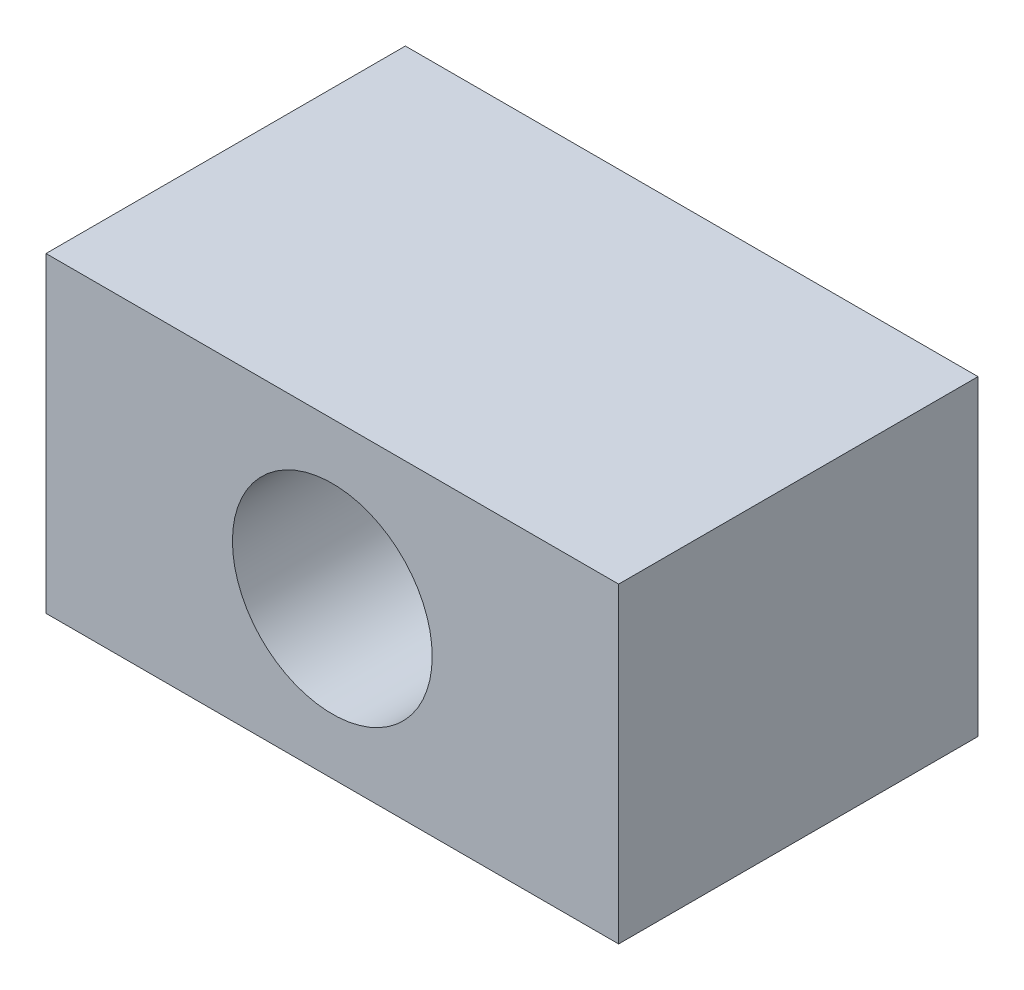
ISO-10303-21;
HEADER;
FILE_DESCRIPTION(('STEP AP214'),'2;1');
FILE_NAME('part.step','',(''),(''),'','','');
FILE_SCHEMA(('AUTOMOTIVE_DESIGN { 1 0 10303 214 1 1 1 1 }'));
ENDSEC;
DATA;
#1=APPLICATION_CONTEXT('core data for automotive mechanical design processes');
#2=APPLICATION_PROTOCOL_DEFINITION('international standard','automotive_design',2000,#1);
#3=PRODUCT_CONTEXT('',#1,'mechanical');
#4=PRODUCT('Part','Part','',(#3));
#5=PRODUCT_RELATED_PRODUCT_CATEGORY('part','',(#4));
#6=PRODUCT_DEFINITION_FORMATION('','',#4);
#7=PRODUCT_DEFINITION_CONTEXT('part definition',#1,'design');
#8=PRODUCT_DEFINITION('design','',#6,#7);
#9=PRODUCT_DEFINITION_SHAPE('','',#8);
#10=(LENGTH_UNIT() NAMED_UNIT(*) SI_UNIT(.MILLI.,.METRE.));
#11=(NAMED_UNIT(*) PLANE_ANGLE_UNIT() SI_UNIT($,.RADIAN.));
#12=(NAMED_UNIT(*) SI_UNIT($,.STERADIAN.) SOLID_ANGLE_UNIT());
#13=UNCERTAINTY_MEASURE_WITH_UNIT(LENGTH_MEASURE(1.E-05),#10,'distance_accuracy_value','');
#14=(GEOMETRIC_REPRESENTATION_CONTEXT(3) GLOBAL_UNCERTAINTY_ASSIGNED_CONTEXT((#13)) GLOBAL_UNIT_ASSIGNED_CONTEXT((#10,
#11,#12)) REPRESENTATION_CONTEXT('',''));
#15=CARTESIAN_POINT('',(0.,0.,0.));
#16=DIRECTION('',(0.,0.,1.));
#17=DIRECTION('',(1.,0.,0.));
#18=AXIS2_PLACEMENT_3D('',#15,#16,#17);
#19=CARTESIAN_POINT('',(706.62430407127,261.961804411073,58.4436794226333));
#20=DIRECTION('',(0.,0.,1.));
#21=DIRECTION('',(1.,0.,0.));
#22=AXIS2_PLACEMENT_3D('',#19,#20,#21);
#23=CYLINDRICAL_SURFACE('',#22,3.50913607914205);
#24=CARTESIAN_POINT('',(706.62430407127,261.961804411073,58.4436794226333));
#25=DIRECTION('',(0.,0.,1.));
#26=DIRECTION('',(1.,0.,0.));
#27=AXIS2_PLACEMENT_3D('',#24,#25,#26);
#28=CIRCLE('',#27,3.50913607914205);
#29=CARTESIAN_POINT('',(710.133440150412,261.961804411073,58.4436794226333));
#30=VERTEX_POINT('',#29);
#31=EDGE_CURVE('E74',#30,#30,#28,.F.);
#32=ORIENTED_EDGE('',*,*,#31,.T.);
#33=EDGE_LOOP('',(#32));
#34=FACE_BOUND('',#33,.T.);
#35=CARTESIAN_POINT('',(706.62430407127,261.961804411073,71.0689669553732));
#36=DIRECTION('',(0.,0.,1.));
#37=DIRECTION('',(1.,0.,0.));
#38=AXIS2_PLACEMENT_3D('',#35,#36,#37);
#39=CIRCLE('',#38,3.50913607914205);
#40=CARTESIAN_POINT('',(710.133440150412,261.961804411073,71.0689669553732));
#41=VERTEX_POINT('',#40);
#42=EDGE_CURVE('E20',#41,#41,#39,.F.);
#43=ORIENTED_EDGE('',*,*,#42,.F.);
#44=EDGE_LOOP('',(#43));
#45=FACE_BOUND('',#44,.T.);
#46=ADVANCED_FACE('F17',(#34,#45),#23,.F.);
#47=CARTESIAN_POINT('',(696.565458905883,267.436518914171,58.443679422634));
#48=DIRECTION('',(0.,1.,0.));
#49=DIRECTION('',(0.,0.,1.));
#50=AXIS2_PLACEMENT_3D('',#47,#48,#49);
#51=PLANE('',#50);
#52=DIRECTION('',(1.,0.,0.));
#53=VECTOR('',#52,1.);
#54=CARTESIAN_POINT('',(706.62430407127,267.436518914171,58.443679422634));
#55=LINE('',#54,#53);
#56=CARTESIAN_POINT('',(716.683149236657,267.436518914171,58.443679422634));
#57=VERTEX_POINT('',#56);
#58=CARTESIAN_POINT('',(696.565458905883,267.436518914171,58.443679422634));
#59=VERTEX_POINT('',#58);
#60=EDGE_CURVE('E72',#57,#59,#55,.F.);
#61=ORIENTED_EDGE('',*,*,#60,.T.);
#62=DIRECTION('',(0.,0.,1.));
#63=VECTOR('',#62,1.);
#64=CARTESIAN_POINT('',(696.565458905883,267.436518914171,58.443679422634));
#65=LINE('',#64,#63);
#66=CARTESIAN_POINT('',(696.565458905883,267.436518914171,71.0689669553739));
#67=VERTEX_POINT('',#66);
#68=EDGE_CURVE('E55',#67,#59,#65,.F.);
#69=ORIENTED_EDGE('',*,*,#68,.F.);
#70=DIRECTION('',(1.,0.,0.));
#71=VECTOR('',#70,1.);
#72=CARTESIAN_POINT('',(706.62430407127,267.436518914171,71.0689669553739));
#73=LINE('',#72,#71);
#74=CARTESIAN_POINT('',(716.683149236657,267.436518914171,71.0689669553739));
#75=VERTEX_POINT('',#74);
#76=EDGE_CURVE('E60',#75,#67,#73,.F.);
#77=ORIENTED_EDGE('',*,*,#76,.F.);
#78=DIRECTION('',(0.,0.,-1.));
#79=VECTOR('',#78,1.);
#80=CARTESIAN_POINT('',(716.683149236657,267.436518914171,58.443679422634));
#81=LINE('',#80,#79);
#82=EDGE_CURVE('E90',#57,#75,#81,.F.);
#83=ORIENTED_EDGE('',*,*,#82,.F.);
#84=EDGE_LOOP('',(#61,#69,#77,#83));
#85=FACE_BOUND('',#84,.T.);
#86=ADVANCED_FACE('F71',(#85),#51,.T.);
#87=CARTESIAN_POINT('',(706.62430407127,261.961804411073,71.0689669553739));
#88=DIRECTION('',(0.,0.,1.));
#89=DIRECTION('',(0.,-1.,0.));
#90=AXIS2_PLACEMENT_3D('',#87,#88,#89);
#91=PLANE('',#90);
#92=DIRECTION('',(0.,1.,0.));
#93=VECTOR('',#92,1.);
#94=CARTESIAN_POINT('',(696.565458905883,256.487089907975,71.0689669553739));
#95=LINE('',#94,#93);
#96=CARTESIAN_POINT('',(696.565458905883,256.487089907975,71.0689669553739));
#97=VERTEX_POINT('',#96);
#98=EDGE_CURVE('E63',#97,#67,#95,.T.);
#99=ORIENTED_EDGE('',*,*,#98,.F.);
#100=DIRECTION('',(1.,0.,0.));
#101=VECTOR('',#100,1.);
#102=CARTESIAN_POINT('',(716.683149236657,256.487089907975,71.0689669553739));
#103=LINE('',#102,#101);
#104=CARTESIAN_POINT('',(716.683149236657,256.487089907975,71.0689669553739));
#105=VERTEX_POINT('',#104);
#106=EDGE_CURVE('E92',#105,#97,#103,.F.);
#107=ORIENTED_EDGE('',*,*,#106,.F.);
#108=DIRECTION('',(0.,1.,0.));
#109=VECTOR('',#108,1.);
#110=CARTESIAN_POINT('',(716.683149236657,267.436518914171,71.0689669553739));
#111=LINE('',#110,#109);
#112=EDGE_CURVE('E66',#75,#105,#111,.F.);
#113=ORIENTED_EDGE('',*,*,#112,.F.);
#114=ORIENTED_EDGE('',*,*,#76,.T.);
#115=EDGE_LOOP('',(#99,#107,#113,#114));
#116=FACE_BOUND('',#115,.T.);
#117=ORIENTED_EDGE('',*,*,#42,.T.);
#118=EDGE_LOOP('',(#117));
#119=FACE_BOUND('',#118,.T.);
#120=ADVANCED_FACE('F61',(#116,#119),#91,.T.);
#121=CARTESIAN_POINT('',(696.565458905883,256.487089907975,58.443679422634));
#122=DIRECTION('',(-1.,0.,0.));
#123=DIRECTION('',(0.,0.,1.));
#124=AXIS2_PLACEMENT_3D('',#121,#122,#123);
#125=PLANE('',#124);
#126=DIRECTION('',(0.,-1.,0.));
#127=VECTOR('',#126,1.);
#128=CARTESIAN_POINT('',(696.565458905883,261.961804411073,58.443679422634));
#129=LINE('',#128,#127);
#130=CARTESIAN_POINT('',(696.565458905883,256.487089907975,58.443679422634));
#131=VERTEX_POINT('',#130);
#132=EDGE_CURVE('E83',#59,#131,#129,.T.);
#133=ORIENTED_EDGE('',*,*,#132,.T.);
#134=DIRECTION('',(0.,0.,1.));
#135=VECTOR('',#134,1.);
#136=CARTESIAN_POINT('',(696.565458905883,256.487089907975,58.443679422634));
#137=LINE('',#136,#135);
#138=EDGE_CURVE('E78',#97,#131,#137,.F.);
#139=ORIENTED_EDGE('',*,*,#138,.F.);
#140=ORIENTED_EDGE('',*,*,#98,.T.);
#141=ORIENTED_EDGE('',*,*,#68,.T.);
#142=EDGE_LOOP('',(#133,#139,#140,#141));
#143=FACE_BOUND('',#142,.T.);
#144=ADVANCED_FACE('F76',(#143),#125,.T.);
#145=CARTESIAN_POINT('',(706.62430407127,261.961804411073,58.443679422634));
#146=DIRECTION('',(0.,0.,1.));
#147=DIRECTION('',(0.,-1.,0.));
#148=AXIS2_PLACEMENT_3D('',#145,#146,#147);
#149=PLANE('',#148);
#150=DIRECTION('',(0.,1.,0.));
#151=VECTOR('',#150,1.);
#152=CARTESIAN_POINT('',(716.683149236657,267.436518914171,58.443679422634));
#153=LINE('',#152,#151);
#154=CARTESIAN_POINT('',(716.683149236657,256.487089907975,58.443679422634));
#155=VERTEX_POINT('',#154);
#156=EDGE_CURVE('E35',#155,#57,#153,.T.);
#157=ORIENTED_EDGE('',*,*,#156,.F.);
#158=DIRECTION('',(1.,0.,0.));
#159=VECTOR('',#158,1.);
#160=CARTESIAN_POINT('',(716.683149236657,256.487089907975,58.443679422634));
#161=LINE('',#160,#159);
#162=EDGE_CURVE('E26',#131,#155,#161,.T.);
#163=ORIENTED_EDGE('',*,*,#162,.F.);
#164=ORIENTED_EDGE('',*,*,#132,.F.);
#165=ORIENTED_EDGE('',*,*,#60,.F.);
#166=EDGE_LOOP('',(#157,#163,#164,#165));
#167=FACE_BOUND('',#166,.T.);
#168=ORIENTED_EDGE('',*,*,#31,.F.);
#169=EDGE_LOOP('',(#168));
#170=FACE_BOUND('',#169,.T.);
#171=ADVANCED_FACE('F98',(#167,#170),#149,.F.);
#172=CARTESIAN_POINT('',(716.683149236657,267.436518914171,58.443679422634));
#173=DIRECTION('',(1.,0.,0.));
#174=DIRECTION('',(0.,0.,-1.));
#175=AXIS2_PLACEMENT_3D('',#172,#173,#174);
#176=PLANE('',#175);
#177=ORIENTED_EDGE('',*,*,#156,.T.);
#178=ORIENTED_EDGE('',*,*,#82,.T.);
#179=ORIENTED_EDGE('',*,*,#112,.T.);
#180=DIRECTION('',(0.,0.,1.));
#181=VECTOR('',#180,1.);
#182=CARTESIAN_POINT('',(716.683149236657,256.487089907975,58.443679422634));
#183=LINE('',#182,#181);
#184=EDGE_CURVE('E11',#155,#105,#183,.T.);
#185=ORIENTED_EDGE('',*,*,#184,.F.);
#186=EDGE_LOOP('',(#177,#178,#179,#185));
#187=FACE_BOUND('',#186,.T.);
#188=ADVANCED_FACE('F101',(#187),#176,.T.);
#189=CARTESIAN_POINT('',(716.683149236657,256.487089907975,58.443679422634));
#190=DIRECTION('',(0.,-1.,0.));
#191=DIRECTION('',(1.,0.,0.));
#192=AXIS2_PLACEMENT_3D('',#189,#190,#191);
#193=PLANE('',#192);
#194=ORIENTED_EDGE('',*,*,#162,.T.);
#195=ORIENTED_EDGE('',*,*,#184,.T.);
#196=ORIENTED_EDGE('',*,*,#106,.T.);
#197=ORIENTED_EDGE('',*,*,#138,.T.);
#198=EDGE_LOOP('',(#194,#195,#196,#197));
#199=FACE_BOUND('',#198,.T.);
#200=ADVANCED_FACE('F97',(#199),#193,.T.);
#201=CLOSED_SHELL('',(#46,#86,#120,#144,#171,#188,#200));
#202=MANIFOLD_SOLID_BREP('B1',#201);
#203=ADVANCED_BREP_SHAPE_REPRESENTATION('',(#18,#202),#14);
#204=SHAPE_DEFINITION_REPRESENTATION(#9,#203);
ENDSEC;
END-ISO-10303-21;
